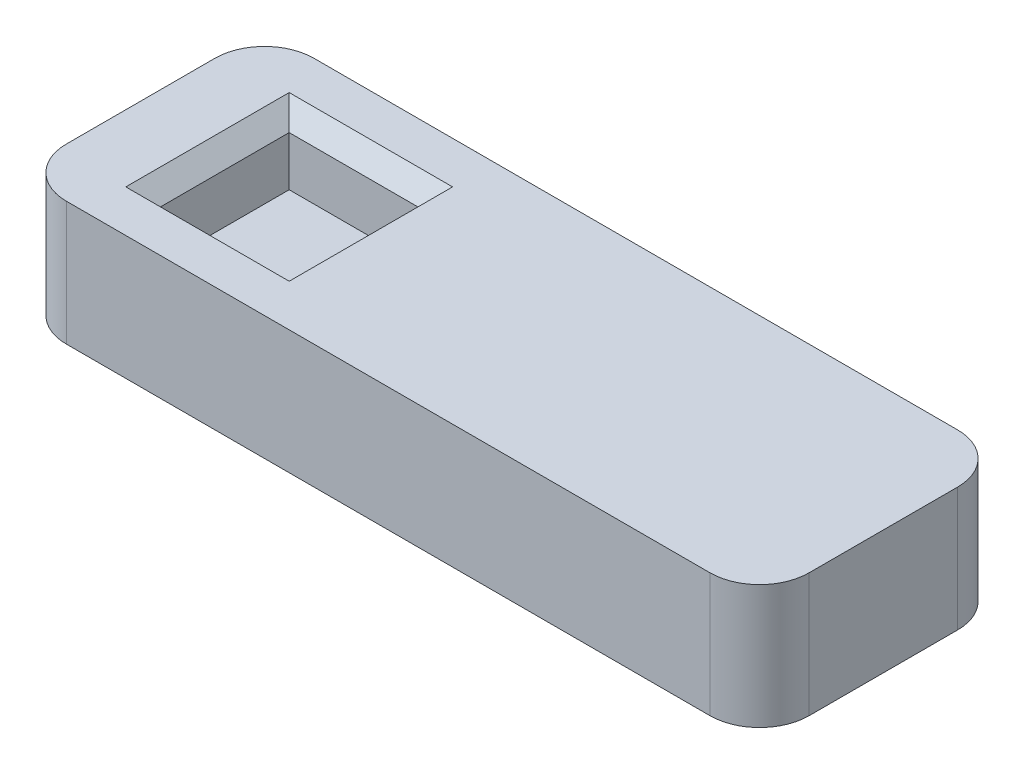
ISO-10303-21;
HEADER;
FILE_DESCRIPTION(('STEP AP214'),'2;1');
FILE_NAME('part.step','',(''),(''),'','','');
FILE_SCHEMA(('AUTOMOTIVE_DESIGN { 1 0 10303 214 1 1 1 1 }'));
ENDSEC;
DATA;
#1=APPLICATION_CONTEXT('core data for automotive mechanical design processes');
#2=APPLICATION_PROTOCOL_DEFINITION('international standard','automotive_design',2000,#1);
#3=PRODUCT_CONTEXT('',#1,'mechanical');
#4=PRODUCT('Part','Part','',(#3));
#5=PRODUCT_RELATED_PRODUCT_CATEGORY('part','',(#4));
#6=PRODUCT_DEFINITION_FORMATION('','',#4);
#7=PRODUCT_DEFINITION_CONTEXT('part definition',#1,'design');
#8=PRODUCT_DEFINITION('design','',#6,#7);
#9=PRODUCT_DEFINITION_SHAPE('','',#8);
#10=(LENGTH_UNIT() NAMED_UNIT(*) SI_UNIT(.MILLI.,.METRE.));
#11=(NAMED_UNIT(*) PLANE_ANGLE_UNIT() SI_UNIT($,.RADIAN.));
#12=(NAMED_UNIT(*) SI_UNIT($,.STERADIAN.) SOLID_ANGLE_UNIT());
#13=UNCERTAINTY_MEASURE_WITH_UNIT(LENGTH_MEASURE(1.E-05),#10,'distance_accuracy_value','');
#14=(GEOMETRIC_REPRESENTATION_CONTEXT(3) GLOBAL_UNCERTAINTY_ASSIGNED_CONTEXT((#13)) GLOBAL_UNIT_ASSIGNED_CONTEXT((#10,
#11,#12)) REPRESENTATION_CONTEXT('',''));
#15=CARTESIAN_POINT('',(0.,0.,0.));
#16=DIRECTION('',(0.,0.,1.));
#17=DIRECTION('',(1.,0.,0.));
#18=AXIS2_PLACEMENT_3D('',#15,#16,#17);
#19=CARTESIAN_POINT('',(2.,5.,-8.));
#20=DIRECTION('',(0.,1.,0.));
#21=DIRECTION('',(0.,0.,1.));
#22=AXIS2_PLACEMENT_3D('',#19,#20,#21);
#23=CYLINDRICAL_SURFACE('',#22,2.);
#24=DIRECTION('',(0.,1.,0.));
#25=VECTOR('',#24,1.);
#26=CARTESIAN_POINT('',(2.,5.,-10.));
#27=LINE('',#26,#25);
#28=CARTESIAN_POINT('',(2.,0.,-10.));
#29=VERTEX_POINT('',#28);
#30=CARTESIAN_POINT('',(2.,5.,-10.));
#31=VERTEX_POINT('',#30);
#32=EDGE_CURVE('E243',#29,#31,#27,.T.);
#33=ORIENTED_EDGE('',*,*,#32,.F.);
#34=CARTESIAN_POINT('',(2.,0.,-8.));
#35=DIRECTION('',(0.,-1.,0.));
#36=DIRECTION('',(0.,0.,-1.));
#37=AXIS2_PLACEMENT_3D('',#34,#35,#36);
#38=CIRCLE('',#37,2.);
#39=CARTESIAN_POINT('',(0.,0.,-8.));
#40=VERTEX_POINT('',#39);
#41=EDGE_CURVE('E40',#40,#29,#38,.T.);
#42=ORIENTED_EDGE('',*,*,#41,.F.);
#43=DIRECTION('',(0.,1.,0.));
#44=VECTOR('',#43,1.);
#45=CARTESIAN_POINT('',(0.,5.,-8.));
#46=LINE('',#45,#44);
#47=CARTESIAN_POINT('',(0.,5.,-8.));
#48=VERTEX_POINT('',#47);
#49=EDGE_CURVE('E246',#48,#40,#46,.F.);
#50=ORIENTED_EDGE('',*,*,#49,.F.);
#51=CARTESIAN_POINT('',(2.,5.,-8.));
#52=DIRECTION('',(0.,-1.,0.));
#53=DIRECTION('',(0.,0.,-1.));
#54=AXIS2_PLACEMENT_3D('',#51,#52,#53);
#55=CIRCLE('',#54,2.);
#56=EDGE_CURVE('E11',#31,#48,#55,.F.);
#57=ORIENTED_EDGE('',*,*,#56,.F.);
#58=EDGE_LOOP('',(#33,#42,#50,#57));
#59=FACE_BOUND('',#58,.T.);
#60=ADVANCED_FACE('F33',(#59),#23,.T.);
#61=CARTESIAN_POINT('',(2.,5.,-2.));
#62=DIRECTION('',(0.,1.,0.));
#63=DIRECTION('',(0.,0.,1.));
#64=AXIS2_PLACEMENT_3D('',#61,#62,#63);
#65=CYLINDRICAL_SURFACE('',#64,2.);
#66=DIRECTION('',(0.,1.,0.));
#67=VECTOR('',#66,1.);
#68=CARTESIAN_POINT('',(0.,5.,-2.));
#69=LINE('',#68,#67);
#70=CARTESIAN_POINT('',(0.,0.,-2.));
#71=VERTEX_POINT('',#70);
#72=CARTESIAN_POINT('',(0.,5.,-2.));
#73=VERTEX_POINT('',#72);
#74=EDGE_CURVE('E232',#71,#73,#69,.T.);
#75=ORIENTED_EDGE('',*,*,#74,.F.);
#76=CARTESIAN_POINT('',(2.,0.,-2.));
#77=DIRECTION('',(0.,-1.,0.));
#78=DIRECTION('',(0.,0.,-1.));
#79=AXIS2_PLACEMENT_3D('',#76,#77,#78);
#80=CIRCLE('',#79,2.);
#81=CARTESIAN_POINT('',(2.,0.,0.));
#82=VERTEX_POINT('',#81);
#83=EDGE_CURVE('E238',#82,#71,#80,.T.);
#84=ORIENTED_EDGE('',*,*,#83,.F.);
#85=DIRECTION('',(0.,1.,0.));
#86=VECTOR('',#85,1.);
#87=CARTESIAN_POINT('',(2.,5.,0.));
#88=LINE('',#87,#86);
#89=CARTESIAN_POINT('',(2.,5.,0.));
#90=VERTEX_POINT('',#89);
#91=EDGE_CURVE('E235',#90,#82,#88,.F.);
#92=ORIENTED_EDGE('',*,*,#91,.F.);
#93=CARTESIAN_POINT('',(2.,5.,-2.));
#94=DIRECTION('',(0.,-1.,0.));
#95=DIRECTION('',(0.,0.,-1.));
#96=AXIS2_PLACEMENT_3D('',#93,#94,#95);
#97=CIRCLE('',#96,2.);
#98=EDGE_CURVE('E241',#73,#90,#97,.F.);
#99=ORIENTED_EDGE('',*,*,#98,.F.);
#100=EDGE_LOOP('',(#75,#84,#92,#99));
#101=FACE_BOUND('',#100,.T.);
#102=ADVANCED_FACE('F275',(#101),#65,.T.);
#103=CARTESIAN_POINT('',(28.,5.,-8.));
#104=DIRECTION('',(0.,-1.,0.));
#105=DIRECTION('',(0.,0.,-1.));
#106=AXIS2_PLACEMENT_3D('',#103,#104,#105);
#107=CYLINDRICAL_SURFACE('',#106,2.);
#108=DIRECTION('',(0.,-1.,0.));
#109=VECTOR('',#108,1.);
#110=CARTESIAN_POINT('',(28.,5.,-10.));
#111=LINE('',#110,#109);
#112=CARTESIAN_POINT('',(28.,5.,-10.));
#113=VERTEX_POINT('',#112);
#114=CARTESIAN_POINT('',(28.,0.,-10.));
#115=VERTEX_POINT('',#114);
#116=EDGE_CURVE('E222',#113,#115,#111,.T.);
#117=ORIENTED_EDGE('',*,*,#116,.F.);
#118=CARTESIAN_POINT('',(28.,5.,-8.));
#119=DIRECTION('',(0.,-1.,0.));
#120=DIRECTION('',(0.,0.,-1.));
#121=AXIS2_PLACEMENT_3D('',#118,#119,#120);
#122=CIRCLE('',#121,2.);
#123=CARTESIAN_POINT('',(30.,5.,-8.));
#124=VERTEX_POINT('',#123);
#125=EDGE_CURVE('E228',#124,#113,#122,.F.);
#126=ORIENTED_EDGE('',*,*,#125,.F.);
#127=DIRECTION('',(0.,-1.,0.));
#128=VECTOR('',#127,1.);
#129=CARTESIAN_POINT('',(30.,5.,-8.));
#130=LINE('',#129,#128);
#131=CARTESIAN_POINT('',(30.,0.,-8.));
#132=VERTEX_POINT('',#131);
#133=EDGE_CURVE('E225',#132,#124,#130,.F.);
#134=ORIENTED_EDGE('',*,*,#133,.F.);
#135=CARTESIAN_POINT('',(28.,0.,-8.));
#136=DIRECTION('',(0.,-1.,0.));
#137=DIRECTION('',(0.,0.,-1.));
#138=AXIS2_PLACEMENT_3D('',#135,#136,#137);
#139=CIRCLE('',#138,2.);
#140=EDGE_CURVE('E230',#115,#132,#139,.T.);
#141=ORIENTED_EDGE('',*,*,#140,.F.);
#142=EDGE_LOOP('',(#117,#126,#134,#141));
#143=FACE_BOUND('',#142,.T.);
#144=ADVANCED_FACE('F256',(#143),#107,.T.);
#145=CARTESIAN_POINT('',(28.,5.,-2.));
#146=DIRECTION('',(0.,-1.,0.));
#147=DIRECTION('',(0.,0.,-1.));
#148=AXIS2_PLACEMENT_3D('',#145,#146,#147);
#149=CYLINDRICAL_SURFACE('',#148,2.);
#150=DIRECTION('',(0.,-1.,0.));
#151=VECTOR('',#150,1.);
#152=CARTESIAN_POINT('',(30.,5.,-2.));
#153=LINE('',#152,#151);
#154=CARTESIAN_POINT('',(30.,5.,-2.));
#155=VERTEX_POINT('',#154);
#156=CARTESIAN_POINT('',(30.,0.,-2.));
#157=VERTEX_POINT('',#156);
#158=EDGE_CURVE('E205',#155,#157,#153,.T.);
#159=ORIENTED_EDGE('',*,*,#158,.F.);
#160=CARTESIAN_POINT('',(28.,5.,-2.));
#161=DIRECTION('',(0.,-1.,0.));
#162=DIRECTION('',(0.,0.,-1.));
#163=AXIS2_PLACEMENT_3D('',#160,#161,#162);
#164=CIRCLE('',#163,2.);
#165=CARTESIAN_POINT('',(28.,5.,0.));
#166=VERTEX_POINT('',#165);
#167=EDGE_CURVE('E217',#166,#155,#164,.F.);
#168=ORIENTED_EDGE('',*,*,#167,.F.);
#169=DIRECTION('',(0.,-1.,0.));
#170=VECTOR('',#169,1.);
#171=CARTESIAN_POINT('',(28.,5.,0.));
#172=LINE('',#171,#170);
#173=CARTESIAN_POINT('',(28.,0.,0.));
#174=VERTEX_POINT('',#173);
#175=EDGE_CURVE('E214',#174,#166,#172,.F.);
#176=ORIENTED_EDGE('',*,*,#175,.F.);
#177=CARTESIAN_POINT('',(28.,0.,-2.));
#178=DIRECTION('',(0.,-1.,0.));
#179=DIRECTION('',(0.,0.,-1.));
#180=AXIS2_PLACEMENT_3D('',#177,#178,#179);
#181=CIRCLE('',#180,2.);
#182=EDGE_CURVE('E219',#157,#174,#181,.T.);
#183=ORIENTED_EDGE('',*,*,#182,.F.);
#184=EDGE_LOOP('',(#159,#168,#176,#183));
#185=FACE_BOUND('',#184,.T.);
#186=ADVANCED_FACE('F267',(#185),#149,.T.);
#187=CARTESIAN_POINT('',(0.,5.,0.));
#188=DIRECTION('',(1.,0.,0.));
#189=DIRECTION('',(0.,0.,-1.));
#190=AXIS2_PLACEMENT_3D('',#187,#188,#189);
#191=PLANE('',#190);
#192=DIRECTION('',(0.,0.,1.));
#193=VECTOR('',#192,1.);
#194=CARTESIAN_POINT('',(0.,5.,0.));
#195=LINE('',#194,#193);
#196=EDGE_CURVE('E170',#48,#73,#195,.T.);
#197=ORIENTED_EDGE('',*,*,#196,.F.);
#198=ORIENTED_EDGE('',*,*,#49,.T.);
#199=DIRECTION('',(0.,0.,1.));
#200=VECTOR('',#199,1.);
#201=CARTESIAN_POINT('',(0.,0.,0.));
#202=LINE('',#201,#200);
#203=EDGE_CURVE('E165',#40,#71,#202,.T.);
#204=ORIENTED_EDGE('',*,*,#203,.T.);
#205=ORIENTED_EDGE('',*,*,#74,.T.);
#206=EDGE_LOOP('',(#197,#198,#204,#205));
#207=FACE_BOUND('',#206,.T.);
#208=ADVANCED_FACE('F278',(#207),#191,.F.);
#209=CARTESIAN_POINT('',(0.,5.,0.));
#210=DIRECTION('',(0.,0.,-1.));
#211=DIRECTION('',(-1.,0.,0.));
#212=AXIS2_PLACEMENT_3D('',#209,#210,#211);
#213=PLANE('',#212);
#214=DIRECTION('',(1.,0.,0.));
#215=VECTOR('',#214,1.);
#216=CARTESIAN_POINT('',(0.,5.,0.));
#217=LINE('',#216,#215);
#218=EDGE_CURVE('E172',#90,#166,#217,.T.);
#219=ORIENTED_EDGE('',*,*,#218,.F.);
#220=ORIENTED_EDGE('',*,*,#91,.T.);
#221=DIRECTION('',(1.,0.,0.));
#222=VECTOR('',#221,1.);
#223=CARTESIAN_POINT('',(0.,0.,0.));
#224=LINE('',#223,#222);
#225=EDGE_CURVE('E182',#82,#174,#224,.T.);
#226=ORIENTED_EDGE('',*,*,#225,.T.);
#227=ORIENTED_EDGE('',*,*,#175,.T.);
#228=EDGE_LOOP('',(#219,#220,#226,#227));
#229=FACE_BOUND('',#228,.T.);
#230=ADVANCED_FACE('F270',(#229),#213,.F.);
#231=CARTESIAN_POINT('',(30.,5.,0.));
#232=DIRECTION('',(-1.,0.,0.));
#233=DIRECTION('',(0.,0.,1.));
#234=AXIS2_PLACEMENT_3D('',#231,#232,#233);
#235=PLANE('',#234);
#236=DIRECTION('',(0.,0.,-1.));
#237=VECTOR('',#236,1.);
#238=CARTESIAN_POINT('',(30.,0.,0.));
#239=LINE('',#238,#237);
#240=EDGE_CURVE('E184',#157,#132,#239,.T.);
#241=ORIENTED_EDGE('',*,*,#240,.T.);
#242=ORIENTED_EDGE('',*,*,#133,.T.);
#243=DIRECTION('',(0.,0.,-1.));
#244=VECTOR('',#243,1.);
#245=CARTESIAN_POINT('',(30.,5.,0.));
#246=LINE('',#245,#244);
#247=EDGE_CURVE('E175',#155,#124,#246,.T.);
#248=ORIENTED_EDGE('',*,*,#247,.F.);
#249=ORIENTED_EDGE('',*,*,#158,.T.);
#250=EDGE_LOOP('',(#241,#242,#248,#249));
#251=FACE_BOUND('',#250,.T.);
#252=ADVANCED_FACE('F262',(#251),#235,.F.);
#253=CARTESIAN_POINT('',(0.,5.,-10.));
#254=DIRECTION('',(0.,0.,1.));
#255=DIRECTION('',(1.,0.,0.));
#256=AXIS2_PLACEMENT_3D('',#253,#254,#255);
#257=PLANE('',#256);
#258=DIRECTION('',(-1.,0.,0.));
#259=VECTOR('',#258,1.);
#260=CARTESIAN_POINT('',(0.,0.,-10.));
#261=LINE('',#260,#259);
#262=EDGE_CURVE('E173',#115,#29,#261,.T.);
#263=ORIENTED_EDGE('',*,*,#262,.T.);
#264=ORIENTED_EDGE('',*,*,#32,.T.);
#265=DIRECTION('',(-1.,0.,0.));
#266=VECTOR('',#265,1.);
#267=CARTESIAN_POINT('',(0.,5.,-10.));
#268=LINE('',#267,#266);
#269=EDGE_CURVE('E178',#113,#31,#268,.T.);
#270=ORIENTED_EDGE('',*,*,#269,.F.);
#271=ORIENTED_EDGE('',*,*,#116,.T.);
#272=EDGE_LOOP('',(#263,#264,#270,#271));
#273=FACE_BOUND('',#272,.T.);
#274=ADVANCED_FACE('F253',(#273),#257,.F.);
#275=CARTESIAN_POINT('',(0.,5.,0.));
#276=DIRECTION('',(0.,-1.,0.));
#277=DIRECTION('',(0.,0.,-1.));
#278=AXIS2_PLACEMENT_3D('',#275,#276,#277);
#279=PLANE('',#278);
#280=DIRECTION('',(0.,0.,1.));
#281=VECTOR('',#280,1.);
#282=CARTESIAN_POINT('',(9.3,5.,0.));
#283=LINE('',#282,#281);
#284=CARTESIAN_POINT('',(9.3,5.,-8.3));
#285=VERTEX_POINT('',#284);
#286=CARTESIAN_POINT('',(9.3,5.,-1.7));
#287=VERTEX_POINT('',#286);
#288=EDGE_CURVE('E195',#285,#287,#283,.T.);
#289=ORIENTED_EDGE('',*,*,#288,.T.);
#290=DIRECTION('',(-1.,0.,0.));
#291=VECTOR('',#290,1.);
#292=CARTESIAN_POINT('',(0.,5.,-1.7));
#293=LINE('',#292,#291);
#294=CARTESIAN_POINT('',(2.7,5.,-1.7));
#295=VERTEX_POINT('',#294);
#296=EDGE_CURVE('E197',#287,#295,#293,.T.);
#297=ORIENTED_EDGE('',*,*,#296,.T.);
#298=DIRECTION('',(0.,0.,-1.));
#299=VECTOR('',#298,1.);
#300=CARTESIAN_POINT('',(2.7,5.,0.));
#301=LINE('',#300,#299);
#302=CARTESIAN_POINT('',(2.7,5.,-8.3));
#303=VERTEX_POINT('',#302);
#304=EDGE_CURVE('E193',#295,#303,#301,.T.);
#305=ORIENTED_EDGE('',*,*,#304,.T.);
#306=DIRECTION('',(1.,0.,0.));
#307=VECTOR('',#306,1.);
#308=CARTESIAN_POINT('',(0.,5.,-8.3));
#309=LINE('',#308,#307);
#310=EDGE_CURVE('E191',#303,#285,#309,.T.);
#311=ORIENTED_EDGE('',*,*,#310,.T.);
#312=EDGE_LOOP('',(#289,#297,#305,#311));
#313=FACE_BOUND('',#312,.T.);
#314=ORIENTED_EDGE('',*,*,#269,.T.);
#315=ORIENTED_EDGE('',*,*,#56,.T.);
#316=ORIENTED_EDGE('',*,*,#196,.T.);
#317=ORIENTED_EDGE('',*,*,#98,.T.);
#318=ORIENTED_EDGE('',*,*,#218,.T.);
#319=ORIENTED_EDGE('',*,*,#167,.T.);
#320=ORIENTED_EDGE('',*,*,#247,.T.);
#321=ORIENTED_EDGE('',*,*,#125,.T.);
#322=EDGE_LOOP('',(#314,#315,#316,#317,#318,#319,#320,#321));
#323=FACE_BOUND('',#322,.T.);
#324=ADVANCED_FACE('F279',(#313,#323),#279,.F.);
#325=CARTESIAN_POINT('',(0.,0.,0.));
#326=DIRECTION('',(0.,-1.,0.));
#327=DIRECTION('',(0.,0.,-1.));
#328=AXIS2_PLACEMENT_3D('',#325,#326,#327);
#329=PLANE('',#328);
#330=ORIENTED_EDGE('',*,*,#203,.F.);
#331=ORIENTED_EDGE('',*,*,#41,.T.);
#332=ORIENTED_EDGE('',*,*,#262,.F.);
#333=ORIENTED_EDGE('',*,*,#140,.T.);
#334=ORIENTED_EDGE('',*,*,#240,.F.);
#335=ORIENTED_EDGE('',*,*,#182,.T.);
#336=ORIENTED_EDGE('',*,*,#225,.F.);
#337=ORIENTED_EDGE('',*,*,#83,.T.);
#338=EDGE_LOOP('',(#330,#331,#332,#333,#334,#335,#336,#337));
#339=FACE_BOUND('',#338,.T.);
#340=ADVANCED_FACE('F250',(#339),#329,.T.);
#341=CARTESIAN_POINT('',(8.6,2.3,-7.6));
#342=DIRECTION('',(1.,0.,0.));
#343=DIRECTION('',(0.,0.,-1.));
#344=AXIS2_PLACEMENT_3D('',#341,#342,#343);
#345=PLANE('',#344);
#346=DIRECTION('',(0.,1.,0.));
#347=VECTOR('',#346,1.);
#348=CARTESIAN_POINT('',(8.6,2.3,-2.4));
#349=LINE('',#348,#347);
#350=CARTESIAN_POINT('',(8.6,2.3,-2.4));
#351=VERTEX_POINT('',#350);
#352=CARTESIAN_POINT('',(8.6,4.3,-2.4));
#353=VERTEX_POINT('',#352);
#354=EDGE_CURVE('E163',#351,#353,#349,.T.);
#355=ORIENTED_EDGE('',*,*,#354,.T.);
#356=DIRECTION('',(0.,0.,-1.));
#357=VECTOR('',#356,1.);
#358=CARTESIAN_POINT('',(8.6,4.3,-7.6));
#359=LINE('',#358,#357);
#360=CARTESIAN_POINT('',(8.6,4.3,-7.6));
#361=VERTEX_POINT('',#360);
#362=EDGE_CURVE('E138',#353,#361,#359,.T.);
#363=ORIENTED_EDGE('',*,*,#362,.T.);
#364=DIRECTION('',(0.,1.,0.));
#365=VECTOR('',#364,1.);
#366=CARTESIAN_POINT('',(8.6,2.3,-7.6));
#367=LINE('',#366,#365);
#368=CARTESIAN_POINT('',(8.6,2.3,-7.6));
#369=VERTEX_POINT('',#368);
#370=EDGE_CURVE('E130',#369,#361,#367,.T.);
#371=ORIENTED_EDGE('',*,*,#370,.F.);
#372=DIRECTION('',(0.,0.,-1.));
#373=VECTOR('',#372,1.);
#374=CARTESIAN_POINT('',(8.6,2.3,-7.6));
#375=LINE('',#374,#373);
#376=EDGE_CURVE('E135',#351,#369,#375,.T.);
#377=ORIENTED_EDGE('',*,*,#376,.F.);
#378=EDGE_LOOP('',(#355,#363,#371,#377));
#379=FACE_BOUND('',#378,.T.);
#380=ADVANCED_FACE('F133',(#379),#345,.F.);
#381=CARTESIAN_POINT('',(3.4,2.3,-2.4));
#382=DIRECTION('',(0.,0.,1.));
#383=DIRECTION('',(1.,0.,0.));
#384=AXIS2_PLACEMENT_3D('',#381,#382,#383);
#385=PLANE('',#384);
#386=DIRECTION('',(0.,1.,0.));
#387=VECTOR('',#386,1.);
#388=CARTESIAN_POINT('',(3.4,2.3,-2.4));
#389=LINE('',#388,#387);
#390=CARTESIAN_POINT('',(3.4,2.3,-2.4));
#391=VERTEX_POINT('',#390);
#392=CARTESIAN_POINT('',(3.4,4.3,-2.4));
#393=VERTEX_POINT('',#392);
#394=EDGE_CURVE('E166',#391,#393,#389,.T.);
#395=ORIENTED_EDGE('',*,*,#394,.T.);
#396=DIRECTION('',(1.,0.,0.));
#397=VECTOR('',#396,1.);
#398=CARTESIAN_POINT('',(3.4,4.3,-2.4));
#399=LINE('',#398,#397);
#400=EDGE_CURVE('E180',#393,#353,#399,.T.);
#401=ORIENTED_EDGE('',*,*,#400,.T.);
#402=ORIENTED_EDGE('',*,*,#354,.F.);
#403=DIRECTION('',(1.,0.,0.));
#404=VECTOR('',#403,1.);
#405=CARTESIAN_POINT('',(3.4,2.3,-2.4));
#406=LINE('',#405,#404);
#407=EDGE_CURVE('E142',#391,#351,#406,.T.);
#408=ORIENTED_EDGE('',*,*,#407,.F.);
#409=EDGE_LOOP('',(#395,#401,#402,#408));
#410=FACE_BOUND('',#409,.T.);
#411=ADVANCED_FACE('F353',(#410),#385,.F.);
#412=CARTESIAN_POINT('',(3.4,2.3,-7.6));
#413=DIRECTION('',(-1.,0.,0.));
#414=DIRECTION('',(0.,0.,1.));
#415=AXIS2_PLACEMENT_3D('',#412,#413,#414);
#416=PLANE('',#415);
#417=DIRECTION('',(0.,1.,0.));
#418=VECTOR('',#417,1.);
#419=CARTESIAN_POINT('',(3.4,2.3,-7.6));
#420=LINE('',#419,#418);
#421=CARTESIAN_POINT('',(3.4,2.3,-7.6));
#422=VERTEX_POINT('',#421);
#423=CARTESIAN_POINT('',(3.4,4.3,-7.6));
#424=VERTEX_POINT('',#423);
#425=EDGE_CURVE('E141',#422,#424,#420,.T.);
#426=ORIENTED_EDGE('',*,*,#425,.T.);
#427=DIRECTION('',(0.,0.,1.));
#428=VECTOR('',#427,1.);
#429=CARTESIAN_POINT('',(3.4,4.3,-7.6));
#430=LINE('',#429,#428);
#431=EDGE_CURVE('E201',#424,#393,#430,.T.);
#432=ORIENTED_EDGE('',*,*,#431,.T.);
#433=ORIENTED_EDGE('',*,*,#394,.F.);
#434=DIRECTION('',(0.,0.,1.));
#435=VECTOR('',#434,1.);
#436=CARTESIAN_POINT('',(3.4,2.3,-7.6));
#437=LINE('',#436,#435);
#438=EDGE_CURVE('E151',#422,#391,#437,.T.);
#439=ORIENTED_EDGE('',*,*,#438,.F.);
#440=EDGE_LOOP('',(#426,#432,#433,#439));
#441=FACE_BOUND('',#440,.T.);
#442=ADVANCED_FACE('F359',(#441),#416,.F.);
#443=CARTESIAN_POINT('',(3.4,2.3,-7.6));
#444=DIRECTION('',(0.,0.,-1.));
#445=DIRECTION('',(-1.,0.,0.));
#446=AXIS2_PLACEMENT_3D('',#443,#444,#445);
#447=PLANE('',#446);
#448=ORIENTED_EDGE('',*,*,#370,.T.);
#449=DIRECTION('',(-1.,0.,0.));
#450=VECTOR('',#449,1.);
#451=CARTESIAN_POINT('',(3.4,4.3,-7.6));
#452=LINE('',#451,#450);
#453=EDGE_CURVE('E203',#361,#424,#452,.T.);
#454=ORIENTED_EDGE('',*,*,#453,.T.);
#455=ORIENTED_EDGE('',*,*,#425,.F.);
#456=DIRECTION('',(-1.,0.,0.));
#457=VECTOR('',#456,1.);
#458=CARTESIAN_POINT('',(3.4,2.3,-7.6));
#459=LINE('',#458,#457);
#460=EDGE_CURVE('E145',#369,#422,#459,.T.);
#461=ORIENTED_EDGE('',*,*,#460,.F.);
#462=EDGE_LOOP('',(#448,#454,#455,#461));
#463=FACE_BOUND('',#462,.T.);
#464=ADVANCED_FACE('F146',(#463),#447,.F.);
#465=CARTESIAN_POINT('',(0.,2.3,0.));
#466=DIRECTION('',(0.,1.,0.));
#467=DIRECTION('',(0.,0.,1.));
#468=AXIS2_PLACEMENT_3D('',#465,#466,#467);
#469=PLANE('',#468);
#470=ORIENTED_EDGE('',*,*,#376,.T.);
#471=ORIENTED_EDGE('',*,*,#460,.T.);
#472=ORIENTED_EDGE('',*,*,#438,.T.);
#473=ORIENTED_EDGE('',*,*,#407,.T.);
#474=EDGE_LOOP('',(#470,#471,#472,#473));
#475=FACE_BOUND('',#474,.T.);
#476=ADVANCED_FACE('F153',(#475),#469,.T.);
#477=CARTESIAN_POINT('',(3.4,4.3,-7.6));
#478=DIRECTION('',(0.,-0.707106781186551,-0.707106781186544));
#479=DIRECTION('',(-1.,0.,0.));
#480=AXIS2_PLACEMENT_3D('',#477,#478,#479);
#481=PLANE('',#480);
#482=DIRECTION('',(0.577350269189628,0.577350269189622,-0.577350269189627));
#483=VECTOR('',#482,1.);
#484=CARTESIAN_POINT('',(8.6,4.3,-7.6));
#485=LINE('',#484,#483);
#486=EDGE_CURVE('E158',#285,#361,#485,.F.);
#487=ORIENTED_EDGE('',*,*,#486,.F.);
#488=ORIENTED_EDGE('',*,*,#310,.F.);
#489=DIRECTION('',(0.577350269189628,-0.577350269189622,0.577350269189627));
#490=VECTOR('',#489,1.);
#491=CARTESIAN_POINT('',(3.4,4.3,-7.6));
#492=LINE('',#491,#490);
#493=EDGE_CURVE('E155',#424,#303,#492,.F.);
#494=ORIENTED_EDGE('',*,*,#493,.F.);
#495=ORIENTED_EDGE('',*,*,#453,.F.);
#496=EDGE_LOOP('',(#487,#488,#494,#495));
#497=FACE_BOUND('',#496,.T.);
#498=ADVANCED_FACE('F301',(#497),#481,.F.);
#499=CARTESIAN_POINT('',(3.4,4.3,-7.6));
#500=DIRECTION('',(-0.707106781186544,-0.707106781186551,0.));
#501=DIRECTION('',(0.,0.,1.));
#502=AXIS2_PLACEMENT_3D('',#499,#500,#501);
#503=PLANE('',#502);
#504=ORIENTED_EDGE('',*,*,#493,.T.);
#505=ORIENTED_EDGE('',*,*,#304,.F.);
#506=DIRECTION('',(0.577350269189628,-0.577350269189622,-0.577350269189628));
#507=VECTOR('',#506,1.);
#508=CARTESIAN_POINT('',(3.4,4.3,-2.4));
#509=LINE('',#508,#507);
#510=EDGE_CURVE('E208',#393,#295,#509,.F.);
#511=ORIENTED_EDGE('',*,*,#510,.F.);
#512=ORIENTED_EDGE('',*,*,#431,.F.);
#513=EDGE_LOOP('',(#504,#505,#511,#512));
#514=FACE_BOUND('',#513,.T.);
#515=ADVANCED_FACE('F304',(#514),#503,.F.);
#516=CARTESIAN_POINT('',(8.6,4.3,-7.6));
#517=DIRECTION('',(0.707106781186544,-0.707106781186551,0.));
#518=DIRECTION('',(0.,0.,-1.));
#519=AXIS2_PLACEMENT_3D('',#516,#517,#518);
#520=PLANE('',#519);
#521=ORIENTED_EDGE('',*,*,#486,.T.);
#522=ORIENTED_EDGE('',*,*,#362,.F.);
#523=DIRECTION('',(0.577350269189628,0.577350269189622,0.577350269189628));
#524=VECTOR('',#523,1.);
#525=CARTESIAN_POINT('',(6.86666666666665,2.56666666666668,-4.13333333333335));
#526=LINE('',#525,#524);
#527=EDGE_CURVE('E206',#287,#353,#526,.F.);
#528=ORIENTED_EDGE('',*,*,#527,.F.);
#529=ORIENTED_EDGE('',*,*,#288,.F.);
#530=EDGE_LOOP('',(#521,#522,#528,#529));
#531=FACE_BOUND('',#530,.T.);
#532=ADVANCED_FACE('F308',(#531),#520,.F.);
#533=CARTESIAN_POINT('',(3.4,4.3,-2.4));
#534=DIRECTION('',(0.,-0.707106781186551,0.707106781186544));
#535=DIRECTION('',(1.,0.,0.));
#536=AXIS2_PLACEMENT_3D('',#533,#534,#535);
#537=PLANE('',#536);
#538=ORIENTED_EDGE('',*,*,#510,.T.);
#539=ORIENTED_EDGE('',*,*,#296,.F.);
#540=ORIENTED_EDGE('',*,*,#527,.T.);
#541=ORIENTED_EDGE('',*,*,#400,.F.);
#542=EDGE_LOOP('',(#538,#539,#540,#541));
#543=FACE_BOUND('',#542,.T.);
#544=ADVANCED_FACE('F312',(#543),#537,.F.);
#545=CLOSED_SHELL('',(#60,#102,#144,#186,#208,#230,#252,#274,#324,#340,#380,#411,#442,#464,#476,
#498,#515,#532,#544));
#546=MANIFOLD_SOLID_BREP('B2',#545);
#547=ADVANCED_BREP_SHAPE_REPRESENTATION('',(#18,#546),#14);
#548=SHAPE_DEFINITION_REPRESENTATION(#9,#547);
ENDSEC;
END-ISO-10303-21;
